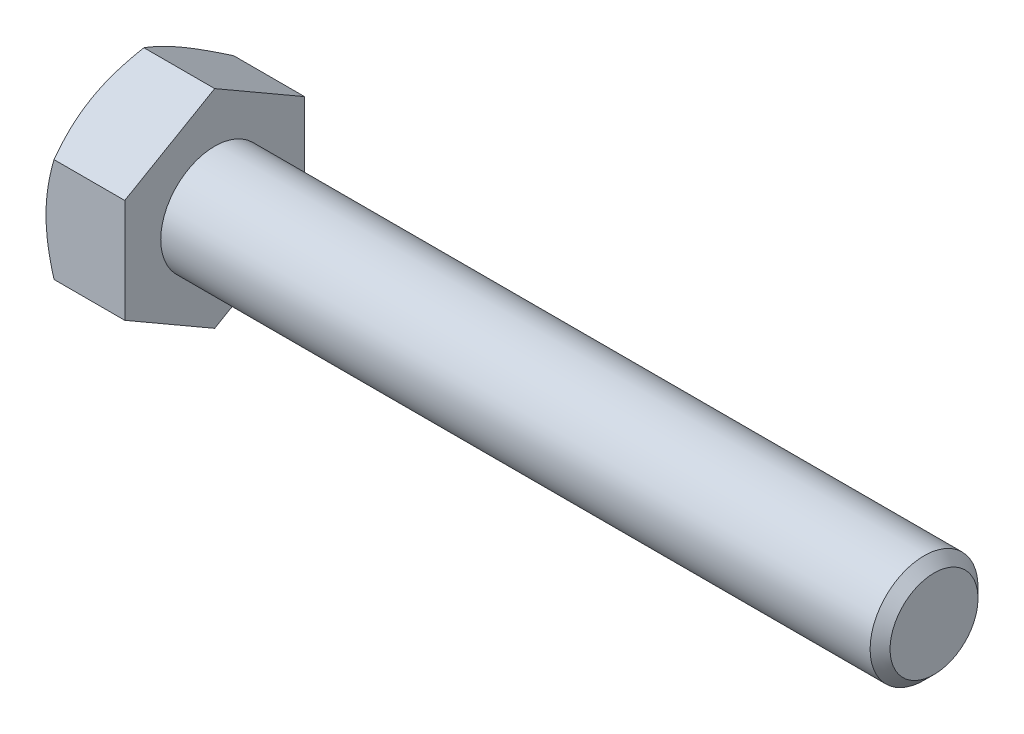
ISO-10303-21;
HEADER;
FILE_DESCRIPTION(('STEP AP214'),'2;1');
FILE_NAME('part.step','',(''),(''),'','','');
FILE_SCHEMA(('AUTOMOTIVE_DESIGN { 1 0 10303 214 1 1 1 1 }'));
ENDSEC;
DATA;
#1=APPLICATION_CONTEXT('core data for automotive mechanical design processes');
#2=APPLICATION_PROTOCOL_DEFINITION('international standard','automotive_design',2000,#1);
#3=PRODUCT_CONTEXT('',#1,'mechanical');
#4=PRODUCT('Part','Part','',(#3));
#5=PRODUCT_RELATED_PRODUCT_CATEGORY('part','',(#4));
#6=PRODUCT_DEFINITION_FORMATION('','',#4);
#7=PRODUCT_DEFINITION_CONTEXT('part definition',#1,'design');
#8=PRODUCT_DEFINITION('design','',#6,#7);
#9=PRODUCT_DEFINITION_SHAPE('','',#8);
#10=(LENGTH_UNIT() NAMED_UNIT(*) SI_UNIT(.MILLI.,.METRE.));
#11=(NAMED_UNIT(*) PLANE_ANGLE_UNIT() SI_UNIT($,.RADIAN.));
#12=(NAMED_UNIT(*) SI_UNIT($,.STERADIAN.) SOLID_ANGLE_UNIT());
#13=UNCERTAINTY_MEASURE_WITH_UNIT(LENGTH_MEASURE(1.E-05),#10,'distance_accuracy_value','');
#14=(GEOMETRIC_REPRESENTATION_CONTEXT(3) GLOBAL_UNCERTAINTY_ASSIGNED_CONTEXT((#13)) GLOBAL_UNIT_ASSIGNED_CONTEXT((#10,
#11,#12)) REPRESENTATION_CONTEXT('',''));
#15=CARTESIAN_POINT('',(0.,0.,0.));
#16=DIRECTION('',(0.,0.,1.));
#17=DIRECTION('',(1.,0.,0.));
#18=AXIS2_PLACEMENT_3D('',#15,#16,#17);
#19=CARTESIAN_POINT('',(0.,5.77350269189626,0.));
#20=DIRECTION('',(1.,0.,0.));
#21=DIRECTION('',(0.,0.,-1.));
#22=AXIS2_PLACEMENT_3D('',#19,#20,#21);
#23=PLANE('',#22);
#24=CARTESIAN_POINT('',(0.,0.,0.));
#25=DIRECTION('',(1.,0.,0.));
#26=DIRECTION('',(0.,1.,0.));
#27=AXIS2_PLACEMENT_3D('',#24,#25,#26);
#28=CIRCLE('',#27,4.99999999999545);
#29=CARTESIAN_POINT('',(1.31445443606291E-12,-4.33012701892023,-2.49999999999886));
#30=VERTEX_POINT('',#29);
#31=CARTESIAN_POINT('',(1.31276181687493E-12,0.,-4.99999999999773));
#32=VERTEX_POINT('',#31);
#33=EDGE_CURVE('E328',#30,#32,#28,.T.);
#34=ORIENTED_EDGE('',*,*,#33,.F.);
#35=CARTESIAN_POINT('',(0.,0.,0.));
#36=DIRECTION('',(1.,0.,0.));
#37=DIRECTION('',(0.,1.,0.));
#38=AXIS2_PLACEMENT_3D('',#35,#36,#37);
#39=CIRCLE('',#38,4.99999999999545);
#40=CARTESIAN_POINT('',(1.31265294309451E-12,-4.33012701892022,2.49999999999887));
#41=VERTEX_POINT('',#40);
#42=EDGE_CURVE('E327',#41,#30,#39,.T.);
#43=ORIENTED_EDGE('',*,*,#42,.F.);
#44=CARTESIAN_POINT('',(0.,0.,0.));
#45=DIRECTION('',(1.,0.,0.));
#46=DIRECTION('',(0.,1.,0.));
#47=AXIS2_PLACEMENT_3D('',#44,#45,#46);
#48=CIRCLE('',#47,4.99999999999545);
#49=CARTESIAN_POINT('',(1.31264503220733E-12,0.,4.99999999999773));
#50=VERTEX_POINT('',#49);
#51=EDGE_CURVE('E89',#50,#41,#48,.T.);
#52=ORIENTED_EDGE('',*,*,#51,.F.);
#53=CARTESIAN_POINT('',(0.,0.,0.));
#54=DIRECTION('',(1.,0.,0.));
#55=DIRECTION('',(0.,1.,0.));
#56=AXIS2_PLACEMENT_3D('',#53,#54,#55);
#57=CIRCLE('',#56,4.99999999999545);
#58=CARTESIAN_POINT('',(1.31288502633462E-12,4.33012701892022,2.49999999999887));
#59=VERTEX_POINT('',#58);
#60=EDGE_CURVE('E87',#59,#50,#57,.T.);
#61=ORIENTED_EDGE('',*,*,#60,.F.);
#62=CARTESIAN_POINT('',(0.,0.,0.));
#63=DIRECTION('',(1.,0.,0.));
#64=DIRECTION('',(0.,1.,0.));
#65=AXIS2_PLACEMENT_3D('',#62,#63,#64);
#66=CIRCLE('',#65,4.99999999999545);
#67=CARTESIAN_POINT('',(1.31224699700013E-12,4.33012701892022,-2.49999999999887));
#68=VERTEX_POINT('',#67);
#69=EDGE_CURVE('E20',#68,#59,#66,.T.);
#70=ORIENTED_EDGE('',*,*,#69,.F.);
#71=CARTESIAN_POINT('',(0.,0.,0.));
#72=DIRECTION('',(1.,0.,0.));
#73=DIRECTION('',(0.,1.,0.));
#74=AXIS2_PLACEMENT_3D('',#71,#72,#73);
#75=CIRCLE('',#74,4.99999999999545);
#76=EDGE_CURVE('E255',#32,#68,#75,.T.);
#77=ORIENTED_EDGE('',*,*,#76,.F.);
#78=EDGE_LOOP('',(#34,#43,#52,#61,#70,#77));
#79=FACE_BOUND('',#78,.T.);
#80=ADVANCED_FACE('F17',(#79),#23,.F.);
#81=CARTESIAN_POINT('',(0.449261479275265,0.,0.));
#82=DIRECTION('',(1.,0.,0.));
#83=DIRECTION('',(0.,1.,0.));
#84=AXIS2_PLACEMENT_3D('',#81,#82,#83);
#85=CONICAL_SURFACE('',#84,5.77814370797114,1.04719755118957);
#86=CARTESIAN_POINT('',(0.446581987394317,5.77350269189495,-2.27818821447054E-12));
#87=CARTESIAN_POINT('',(0.37873199161361,5.65601252710132,-0.203498934814473));
#88=CARTESIAN_POINT('',(0.316569549696799,5.53758145884731,-0.408627562225078));
#89=CARTESIAN_POINT('',(0.206947202600606,5.29967536418135,-0.820693005616808));
#90=CARTESIAN_POINT('',(0.159414596574625,5.18020863614853,-1.02761544838367));
#91=CARTESIAN_POINT('',(0.101052626368534,4.99988106812553,-1.33995195820484));
#92=CARTESIAN_POINT('',(0.083747708038701,4.93954408647721,-1.44445867599508));
#93=CARTESIAN_POINT('',(0.053792533680768,4.81858126545494,-1.65397242783251));
#94=CARTESIAN_POINT('',(0.0411421551416429,4.7579554337263,-1.75897944863763));
#95=CARTESIAN_POINT('',(0.0207183273002109,4.63619066509474,-1.96988221447936));
#96=CARTESIAN_POINT('',(0.0129696792605214,4.57505068020447,-2.0757797746833));
#97=CARTESIAN_POINT('',(0.00259979047148607,4.45265046787549,-2.28778316129432));
#98=CARTESIAN_POINT('',(-2.04348110585966E-05,4.39139021902687,-2.39388902478444));
#99=CARTESIAN_POINT('',(2.62476469222933E-12,4.33012701892219,-2.5));
#100=B_SPLINE_CURVE_WITH_KNOTS('',3,(#86,#87,#88,#89,#90,#91,#92,#93,#94,#95,#96,#97,#98,#99),
.UNSPECIFIED.,.F.,.F.,(4,2,2,2,2,2,4),(0.,0.734036658390385,1.46436443241443,1.83000749078048,
2.19564092445472,2.56310985866278,2.93065154716303),.UNSPECIFIED.);
#101=CARTESIAN_POINT('',(0.446581987394317,5.77350269189495,0.));
#102=VERTEX_POINT('',#101);
#103=EDGE_CURVE('E99',#102,#68,#100,.T.);
#104=ORIENTED_EDGE('',*,*,#103,.T.);
#105=ORIENTED_EDGE('',*,*,#69,.T.);
#106=CARTESIAN_POINT('',(2.62552985528741E-12,4.33012701892219,2.5));
#107=CARTESIAN_POINT('',(-2.04348110582996E-05,4.39139021902687,2.39388902478444));
#108=CARTESIAN_POINT('',(0.00259979047148634,4.45265046787549,2.28778316129432));
#109=CARTESIAN_POINT('',(0.0129696792605219,4.57505068020448,2.0757797746833));
#110=CARTESIAN_POINT('',(0.0207183273002116,4.63619066509475,1.96988221447936));
#111=CARTESIAN_POINT('',(0.0411421551416436,4.7579554337263,1.75897944863763));
#112=CARTESIAN_POINT('',(0.0537925336807684,4.81858126545494,1.65397242783251));
#113=CARTESIAN_POINT('',(0.0837477080387013,4.93954408647721,1.44445867599508));
#114=CARTESIAN_POINT('',(0.101052626368535,4.99988106812553,1.33995195820484));
#115=CARTESIAN_POINT('',(0.159414596574626,5.18020863614853,1.02761544838367));
#116=CARTESIAN_POINT('',(0.206947202600607,5.29967536418135,0.820693005616808));
#117=CARTESIAN_POINT('',(0.3165695496968,5.53758145884731,0.408627562225078));
#118=CARTESIAN_POINT('',(0.37873199161361,5.65601252710132,0.203498934814474));
#119=CARTESIAN_POINT('',(0.446581987394317,5.77350269189495,2.279010260297E-12));
#120=B_SPLINE_CURVE_WITH_KNOTS('',3,(#106,#107,#108,#109,#110,#111,#112,#113,#114,#115,#116,
#117,#118,#119),.UNSPECIFIED.,.F.,.F.,(4,2,2,2,2,2,4),(0.,0.367541688500245,0.735010622708304,
1.10064405638254,1.4662871147486,2.19661488877264,2.93065154716302),.UNSPECIFIED.);
#121=EDGE_CURVE('E97',#59,#102,#120,.T.);
#122=ORIENTED_EDGE('',*,*,#121,.T.);
#123=EDGE_LOOP('',(#104,#105,#122));
#124=FACE_BOUND('',#123,.T.);
#125=ADVANCED_FACE('F95',(#124),#85,.T.);
#126=CARTESIAN_POINT('',(0.449261479275265,0.,0.));
#127=DIRECTION('',(1.,0.,0.));
#128=DIRECTION('',(0.,1.,0.));
#129=AXIS2_PLACEMENT_3D('',#126,#127,#128);
#130=CONICAL_SURFACE('',#129,5.77814370797114,1.04719755118957);
#131=CARTESIAN_POINT('',(0.446581987394314,2.88675134594944,4.99999999999772));
#132=CARTESIAN_POINT('',(0.378731991613608,3.00424151074306,4.79650106518553));
#133=CARTESIAN_POINT('',(0.316569549696798,3.12267257899707,4.59137243777492));
#134=CARTESIAN_POINT('',(0.206947202600605,3.36057867366303,4.1793069943832));
#135=CARTESIAN_POINT('',(0.159414596574625,3.48004540169586,3.97238455161633));
#136=CARTESIAN_POINT('',(0.101052626368534,3.66037296971886,3.66004804179516));
#137=CARTESIAN_POINT('',(0.0837477080387011,3.72070995136718,3.55554132400492));
#138=CARTESIAN_POINT('',(0.0537925336807682,3.84167277238944,3.3460275721675));
#139=CARTESIAN_POINT('',(0.0411421551416431,3.90229860411808,3.24102055136238));
#140=CARTESIAN_POINT('',(0.0207183273002111,4.02406337274964,3.03011778552065));
#141=CARTESIAN_POINT('',(0.0129696792605216,4.08520335763991,2.92422022531671));
#142=CARTESIAN_POINT('',(0.00259979047148639,4.20760356996889,2.71221683870569));
#143=CARTESIAN_POINT('',(-2.04348110581854E-05,4.26886381881751,2.60611097521557));
#144=CARTESIAN_POINT('',(2.62530247415424E-12,4.33012701892219,2.5));
#145=B_SPLINE_CURVE_WITH_KNOTS('',3,(#131,#132,#133,#134,#135,#136,#137,#138,#139,#140,#141,
#142,#143,#144),.UNSPECIFIED.,.F.,.F.,(4,2,2,2,2,2,4),(0.,0.734036658390382,1.46436443241442,
1.83000749078047,2.19564092445471,2.56310985866277,2.93065154716302),.UNSPECIFIED.);
#146=CARTESIAN_POINT('',(0.446581987394314,2.88675134594747,4.99999999999886));
#147=VERTEX_POINT('',#146);
#148=EDGE_CURVE('E102',#147,#59,#145,.T.);
#149=ORIENTED_EDGE('',*,*,#148,.T.);
#150=ORIENTED_EDGE('',*,*,#60,.T.);
#151=CARTESIAN_POINT('',(2.62529284589109E-12,0.,5.));
#152=CARTESIAN_POINT('',(-2.04348110587406E-05,0.122526400209358,5.));
#153=CARTESIAN_POINT('',(0.00259979047148595,0.245046897906593,5.));
#154=CARTESIAN_POINT('',(0.0129696792605216,0.489847322564566,5.));
#155=CARTESIAN_POINT('',(0.0207183273002114,0.612127292345107,5.));
#156=CARTESIAN_POINT('',(0.0411421551416433,0.855656829608219,5.));
#157=CARTESIAN_POINT('',(0.0537925336807679,0.976908493065498,5.));
#158=CARTESIAN_POINT('',(0.0837477080387005,1.21883413511003,5.));
#159=CARTESIAN_POINT('',(0.101052626368534,1.33950809840666,5.));
#160=CARTESIAN_POINT('',(0.159414596574625,1.70016323445266,5.));
#161=CARTESIAN_POINT('',(0.206947202600606,1.93909669051831,5.));
#162=CARTESIAN_POINT('',(0.316569549696798,2.41490887985023,5.));
#163=CARTESIAN_POINT('',(0.378731991613608,2.65177101635825,5.));
#164=CARTESIAN_POINT('',(0.446581987394314,2.88675134594549,5.));
#165=B_SPLINE_CURVE_WITH_KNOTS('',3,(#151,#152,#153,#154,#155,#156,#157,#158,#159,#160,#161,
#162,#163,#164),.UNSPECIFIED.,.F.,.F.,(4,2,2,2,2,2,4),(0.,0.367541688500244,0.735010622708302,
1.10064405638254,1.46628711474859,2.19661488877263,2.93065154716301),.UNSPECIFIED.);
#166=EDGE_CURVE('E105',#50,#147,#165,.T.);
#167=ORIENTED_EDGE('',*,*,#166,.T.);
#168=EDGE_LOOP('',(#149,#150,#167));
#169=FACE_BOUND('',#168,.T.);
#170=ADVANCED_FACE('F103',(#169),#130,.T.);
#171=CARTESIAN_POINT('',(0.449261479275265,0.,0.));
#172=DIRECTION('',(1.,0.,0.));
#173=DIRECTION('',(0.,1.,0.));
#174=AXIS2_PLACEMENT_3D('',#171,#172,#173);
#175=CONICAL_SURFACE('',#174,5.77814370797114,1.04719755118957);
#176=ORIENTED_EDGE('',*,*,#51,.T.);
#177=CARTESIAN_POINT('',(2.62536398849459E-12,-4.33012701892219,2.50000000000001));
#178=CARTESIAN_POINT('',(-2.04348110580301E-05,-4.26886381881751,2.60611097521557));
#179=CARTESIAN_POINT('',(0.0025997904714866,-4.20760356996889,2.71221683870569));
#180=CARTESIAN_POINT('',(0.0129696792605219,-4.0852033576399,2.92422022531671));
#181=CARTESIAN_POINT('',(0.0207183273002113,-4.02406337274963,3.03011778552066));
#182=CARTESIAN_POINT('',(0.0411421551416433,-3.90229860411808,3.24102055136238));
#183=CARTESIAN_POINT('',(0.0537925336807684,-3.84167277238944,3.3460275721675));
#184=CARTESIAN_POINT('',(0.0837477080387012,-3.72070995136717,3.55554132400492));
#185=CARTESIAN_POINT('',(0.101052626368534,-3.66037296971885,3.66004804179516));
#186=CARTESIAN_POINT('',(0.159414596574624,-3.48004540169585,3.97238455161633));
#187=CARTESIAN_POINT('',(0.206947202600605,-3.36057867366303,4.1793069943832));
#188=CARTESIAN_POINT('',(0.316569549696797,-3.12267257899707,4.59137243777492));
#189=CARTESIAN_POINT('',(0.378731991613607,-3.00424151074306,4.79650106518553));
#190=CARTESIAN_POINT('',(0.446581987394313,-2.88675134594944,4.99999999999772));
#191=B_SPLINE_CURVE_WITH_KNOTS('',3,(#177,#178,#179,#180,#181,#182,#183,#184,#185,#186,#187,
#188,#189,#190),.UNSPECIFIED.,.F.,.F.,(4,2,2,2,2,2,4),(0.,0.367541688500244,0.7350106227083,
1.10064405638254,1.46628711474859,2.19661488877263,2.93065154716301),.UNSPECIFIED.);
#192=CARTESIAN_POINT('',(0.446581987394313,-2.88675134594746,4.99999999999886));
#193=VERTEX_POINT('',#192);
#194=EDGE_CURVE('E174',#41,#193,#191,.T.);
#195=ORIENTED_EDGE('',*,*,#194,.T.);
#196=CARTESIAN_POINT('',(0.446581987394313,-2.88675134594549,5.));
#197=CARTESIAN_POINT('',(0.378731991613607,-2.65177101635825,5.));
#198=CARTESIAN_POINT('',(0.316569549696796,-2.41490887985022,5.));
#199=CARTESIAN_POINT('',(0.206947202600604,-1.93909669051831,5.));
#200=CARTESIAN_POINT('',(0.159414596574623,-1.70016323445266,5.));
#201=CARTESIAN_POINT('',(0.101052626368533,-1.33950809840666,5.));
#202=CARTESIAN_POINT('',(0.0837477080387004,-1.21883413511003,5.));
#203=CARTESIAN_POINT('',(0.0537925336807677,-0.976908493065497,5.));
#204=CARTESIAN_POINT('',(0.0411421551416427,-0.855656829608219,5.));
#205=CARTESIAN_POINT('',(0.0207183273002108,-0.612127292345107,5.));
#206=CARTESIAN_POINT('',(0.0129696792605213,-0.489847322564566,5.));
#207=CARTESIAN_POINT('',(0.00259979047148612,-0.245046897906593,5.));
#208=CARTESIAN_POINT('',(-2.04348110584022E-05,-0.122526400209359,5.));
#209=CARTESIAN_POINT('',(2.62529006441466E-12,0.,5.));
#210=B_SPLINE_CURVE_WITH_KNOTS('',3,(#196,#197,#198,#199,#200,#201,#202,#203,#204,#205,#206,
#207,#208,#209),.UNSPECIFIED.,.F.,.F.,(4,2,2,2,2,2,4),(0.,0.73403665839038,1.46436443241442,
1.83000749078047,2.19564092445471,2.56310985866277,2.93065154716301),.UNSPECIFIED.);
#211=EDGE_CURVE('E148',#193,#50,#210,.T.);
#212=ORIENTED_EDGE('',*,*,#211,.T.);
#213=EDGE_LOOP('',(#176,#195,#212));
#214=FACE_BOUND('',#213,.T.);
#215=ADVANCED_FACE('F139',(#214),#175,.T.);
#216=CARTESIAN_POINT('',(0.449261479275265,0.,0.));
#217=DIRECTION('',(1.,0.,0.));
#218=DIRECTION('',(0.,1.,0.));
#219=AXIS2_PLACEMENT_3D('',#216,#217,#218);
#220=CONICAL_SURFACE('',#219,5.77814370797114,1.04719755118957);
#221=ORIENTED_EDGE('',*,*,#42,.T.);
#222=CARTESIAN_POINT('',(2.62887455541919E-12,-4.3301270189222,-2.5));
#223=CARTESIAN_POINT('',(-2.04348110543904E-05,-4.39139021902688,-2.39388902478444));
#224=CARTESIAN_POINT('',(0.00259979047149012,-4.4526504678755,-2.28778316129432));
#225=CARTESIAN_POINT('',(0.0129696792605251,-4.57505068020448,-2.0757797746833));
#226=CARTESIAN_POINT('',(0.0207183273002144,-4.63619066509475,-1.96988221447935));
#227=CARTESIAN_POINT('',(0.0411421551416465,-4.75795543372631,-1.75897944863763));
#228=CARTESIAN_POINT('',(0.0537925336807718,-4.81858126545495,-1.6539724278325));
#229=CARTESIAN_POINT('',(0.0837477080387049,-4.93954408647721,-1.44445867599508));
#230=CARTESIAN_POINT('',(0.101052626368538,-4.99988106812553,-1.33995195820484));
#231=CARTESIAN_POINT('',(0.159414596574629,-5.18020863614853,-1.02761544838367));
#232=CARTESIAN_POINT('',(0.20694720260061,-5.29967536418136,-0.820693005616806));
#233=CARTESIAN_POINT('',(0.316569549696803,-5.53758145884732,-0.408627562225076));
#234=CARTESIAN_POINT('',(0.378731991613614,-5.65601252710133,-0.203498934814472));
#235=CARTESIAN_POINT('',(0.44658198739432,-5.77350269189495,-2.27714056377501E-12));
#236=B_SPLINE_CURVE_WITH_KNOTS('',3,(#222,#223,#224,#225,#226,#227,#228,#229,#230,#231,#232,
#233,#234,#235),.UNSPECIFIED.,.F.,.F.,(4,2,2,2,2,2,4),(0.,0.367541688500245,0.735010622708303,
1.10064405638254,1.4662871147486,2.19661488877264,2.93065154716302),.UNSPECIFIED.);
#237=CARTESIAN_POINT('',(0.446581987394319,-5.77350269189495,0.));
#238=VERTEX_POINT('',#237);
#239=EDGE_CURVE('E302',#30,#238,#236,.T.);
#240=ORIENTED_EDGE('',*,*,#239,.T.);
#241=CARTESIAN_POINT('',(0.446581987394319,-5.77350269189495,2.27890301672166E-12));
#242=CARTESIAN_POINT('',(0.378731991613612,-5.65601252710133,0.203498934814475));
#243=CARTESIAN_POINT('',(0.316569549696802,-5.53758145884731,0.408627562225079));
#244=CARTESIAN_POINT('',(0.206947202600608,-5.29967536418135,0.82069300561681));
#245=CARTESIAN_POINT('',(0.159414596574627,-5.18020863614853,1.02761544838368));
#246=CARTESIAN_POINT('',(0.101052626368535,-4.99988106812553,1.33995195820485));
#247=CARTESIAN_POINT('',(0.083747708038702,-4.93954408647721,1.44445867599509));
#248=CARTESIAN_POINT('',(0.0537925336807687,-4.81858126545494,1.65397242783251));
#249=CARTESIAN_POINT('',(0.0411421551416434,-4.7579554337263,1.75897944863764));
#250=CARTESIAN_POINT('',(0.0207183273002114,-4.63619066509474,1.96988221447936));
#251=CARTESIAN_POINT('',(0.0129696792605221,-4.57505068020447,2.0757797746833));
#252=CARTESIAN_POINT('',(0.00259979047148702,-4.45265046787549,2.28778316129433));
#253=CARTESIAN_POINT('',(-2.0434811057605E-05,-4.39139021902687,2.39388902478444));
#254=CARTESIAN_POINT('',(2.62541076660964E-12,-4.33012701892219,2.50000000000001));
#255=B_SPLINE_CURVE_WITH_KNOTS('',3,(#241,#242,#243,#244,#245,#246,#247,#248,#249,#250,#251,
#252,#253,#254),.UNSPECIFIED.,.F.,.F.,(4,2,2,2,2,2,4),(0.,0.734036658390386,1.46436443241443,
1.83000749078048,2.19564092445473,2.56310985866278,2.93065154716303),.UNSPECIFIED.);
#256=EDGE_CURVE('E169',#238,#41,#255,.T.);
#257=ORIENTED_EDGE('',*,*,#256,.T.);
#258=EDGE_LOOP('',(#221,#240,#257));
#259=FACE_BOUND('',#258,.T.);
#260=ADVANCED_FACE('F318',(#259),#220,.T.);
#261=CARTESIAN_POINT('',(0.449261479275265,0.,0.));
#262=DIRECTION('',(1.,0.,0.));
#263=DIRECTION('',(0.,1.,0.));
#264=AXIS2_PLACEMENT_3D('',#261,#262,#263);
#265=CONICAL_SURFACE('',#264,5.77814370797114,1.04719755118957);
#266=ORIENTED_EDGE('',*,*,#33,.T.);
#267=CARTESIAN_POINT('',(2.62554162158813E-12,0.,-5.));
#268=CARTESIAN_POINT('',(-2.04348110577638E-05,-0.122526400209367,-5.));
#269=CARTESIAN_POINT('',(0.0025997904714872,-0.24504689790661,-5.));
#270=CARTESIAN_POINT('',(0.0129696792605238,-0.4898473225646,-5.));
#271=CARTESIAN_POINT('',(0.0207183273002142,-0.61212729234515,-5.));
#272=CARTESIAN_POINT('',(0.0411421551416489,-0.855656829608277,-5.));
#273=CARTESIAN_POINT('',(0.0537925336807756,-0.976908493065564,-5.));
#274=CARTESIAN_POINT('',(0.0837477080387122,-1.21883413511011,-5.));
#275=CARTESIAN_POINT('',(0.101052626368547,-1.33950809840675,-5.));
#276=CARTESIAN_POINT('',(0.159414596574645,-1.70016323445278,-5.));
#277=CARTESIAN_POINT('',(0.206947202600632,-1.93909669051844,-5.));
#278=CARTESIAN_POINT('',(0.316569549696838,-2.41490887985039,-5.));
#279=CARTESIAN_POINT('',(0.378731991613656,-2.65177101635842,-5.));
#280=CARTESIAN_POINT('',(0.446581987394369,-2.88675134594568,-5.));
#281=B_SPLINE_CURVE_WITH_KNOTS('',3,(#267,#268,#269,#270,#271,#272,#273,#274,#275,#276,#277,
#278,#279,#280),.UNSPECIFIED.,.F.,.F.,(4,2,2,2,2,2,4),(0.,0.367541688500269,0.735010622708351,
1.10064405638261,1.46628711474869,2.19661488877278,2.93065154716321),.UNSPECIFIED.);
#282=CARTESIAN_POINT('',(0.446581987394308,-2.88675134594763,-4.99999999999876));
#283=VERTEX_POINT('',#282);
#284=EDGE_CURVE('E233',#32,#283,#281,.T.);
#285=ORIENTED_EDGE('',*,*,#284,.T.);
#286=CARTESIAN_POINT('',(0.446581987394246,-2.88675134594957,-4.99999999999751));
#287=CARTESIAN_POINT('',(0.37873199161355,-3.00424151074319,-4.79650106518533));
#288=CARTESIAN_POINT('',(0.316569549696749,-3.12267257899719,-4.59137243777475));
#289=CARTESIAN_POINT('',(0.206947202600574,-3.36057867366312,-4.17930699438305));
#290=CARTESIAN_POINT('',(0.159414596574601,-3.48004540169594,-3.9723845516162));
#291=CARTESIAN_POINT('',(0.10105262636852,-3.66037296971892,-3.66004804179506));
#292=CARTESIAN_POINT('',(0.0837477080386896,-3.72070995136724,-3.55554132400483));
#293=CARTESIAN_POINT('',(0.0537925336807619,-3.84167277238949,-3.34602757216742));
#294=CARTESIAN_POINT('',(0.0411421551416391,-3.90229860411813,-3.24102055136231));
#295=CARTESIAN_POINT('',(0.0207183273002108,-4.02406337274967,-3.0301177855206));
#296=CARTESIAN_POINT('',(0.0129696792605228,-4.08520335763994,-2.92422022531667));
#297=CARTESIAN_POINT('',(0.00259979047148944,-4.20760356996891,-2.71221683870567));
#298=CARTESIAN_POINT('',(-2.04348110547413E-05,-4.26886381881752,-2.60611097521556));
#299=CARTESIAN_POINT('',(2.62851298101351E-12,-4.3301270189222,-2.5));
#300=B_SPLINE_CURVE_WITH_KNOTS('',3,(#286,#287,#288,#289,#290,#291,#292,#293,#294,#295,#296,
#297,#298,#299),.UNSPECIFIED.,.F.,.F.,(4,2,2,2,2,2,4),(0.,0.734036658390318,1.46436443241429,
1.83000749078031,2.19564092445452,2.56310985866255,2.93065154716276),.UNSPECIFIED.);
#301=EDGE_CURVE('E301',#283,#30,#300,.T.);
#302=ORIENTED_EDGE('',*,*,#301,.T.);
#303=EDGE_LOOP('',(#266,#285,#302));
#304=FACE_BOUND('',#303,.T.);
#305=ADVANCED_FACE('F247',(#304),#265,.T.);
#306=CARTESIAN_POINT('',(0.449261479275265,0.,0.));
#307=DIRECTION('',(1.,0.,0.));
#308=DIRECTION('',(0.,1.,0.));
#309=AXIS2_PLACEMENT_3D('',#306,#307,#308);
#310=CONICAL_SURFACE('',#309,5.77814370797114,1.04719755118957);
#311=CARTESIAN_POINT('',(0.446581987394314,2.88675134594549,-5.));
#312=CARTESIAN_POINT('',(0.378731991613607,2.65177101635825,-5.));
#313=CARTESIAN_POINT('',(0.316569549696797,2.41490887985023,-5.));
#314=CARTESIAN_POINT('',(0.206947202600605,1.93909669051831,-5.));
#315=CARTESIAN_POINT('',(0.159414596574625,1.70016323445266,-5.));
#316=CARTESIAN_POINT('',(0.101052626368534,1.33950809840666,-5.));
#317=CARTESIAN_POINT('',(0.0837477080387007,1.21883413511003,-5.));
#318=CARTESIAN_POINT('',(0.0537925336807681,0.976908493065498,-5.));
#319=CARTESIAN_POINT('',(0.0411421551416434,0.855656829608219,-5.));
#320=CARTESIAN_POINT('',(0.0207183273002116,0.612127292345108,-5.));
#321=CARTESIAN_POINT('',(0.0129696792605218,0.489847322564566,-5.));
#322=CARTESIAN_POINT('',(0.00259979047148617,0.245046897906593,-5.));
#323=CARTESIAN_POINT('',(-2.04348110584997E-05,0.122526400209358,-5.));
#324=CARTESIAN_POINT('',(2.62552363374986E-12,0.,-5.));
#325=B_SPLINE_CURVE_WITH_KNOTS('',3,(#311,#312,#313,#314,#315,#316,#317,#318,#319,#320,#321,
#322,#323,#324),.UNSPECIFIED.,.F.,.F.,(4,2,2,2,2,2,4),(0.,0.734036658390381,1.46436443241442,
1.83000749078047,2.19564092445471,2.56310985866277,2.93065154716301),.UNSPECIFIED.);
#326=CARTESIAN_POINT('',(0.446581987394694,2.88675134594878,-4.99999999999886));
#327=VERTEX_POINT('',#326);
#328=EDGE_CURVE('E225',#327,#32,#325,.T.);
#329=ORIENTED_EDGE('',*,*,#328,.T.);
#330=ORIENTED_EDGE('',*,*,#76,.T.);
#331=CARTESIAN_POINT('',(2.62466282953535E-12,4.33012701892219,-2.50000000000001));
#332=CARTESIAN_POINT('',(-2.04348110588146E-05,4.26886381881751,-2.60611097521557));
#333=CARTESIAN_POINT('',(0.00259979047148583,4.20760356996889,-2.71221683870569));
#334=CARTESIAN_POINT('',(0.0129696792605211,4.08520335763991,-2.92422022531671));
#335=CARTESIAN_POINT('',(0.0207183273002106,4.02406337274963,-3.03011778552065));
#336=CARTESIAN_POINT('',(0.0411421551416424,3.90229860411808,-3.24102055136238));
#337=CARTESIAN_POINT('',(0.0537925336807672,3.84167277238944,-3.3460275721675));
#338=CARTESIAN_POINT('',(0.0837477080387001,3.72070995136717,-3.55554132400492));
#339=CARTESIAN_POINT('',(0.101052626368534,3.66037296971886,-3.66004804179516));
#340=CARTESIAN_POINT('',(0.159414596574624,3.48004540169586,-3.97238455161633));
#341=CARTESIAN_POINT('',(0.206947202600605,3.36057867366303,-4.17930699438319));
#342=CARTESIAN_POINT('',(0.316569549696797,3.12267257899707,-4.59137243777492));
#343=CARTESIAN_POINT('',(0.378731991613607,3.00424151074306,-4.79650106518553));
#344=CARTESIAN_POINT('',(0.446581987394314,2.88675134594944,-4.99999999999772));
#345=B_SPLINE_CURVE_WITH_KNOTS('',3,(#331,#332,#333,#334,#335,#336,#337,#338,#339,#340,#341,
#342,#343,#344),.UNSPECIFIED.,.F.,.F.,(4,2,2,2,2,2,4),(0.,0.367541688500244,0.735010622708302,
1.10064405638254,1.46628711474859,2.19661488877263,2.93065154716301),.UNSPECIFIED.);
#346=EDGE_CURVE('E115',#68,#327,#345,.T.);
#347=ORIENTED_EDGE('',*,*,#346,.T.);
#348=EDGE_LOOP('',(#329,#330,#347));
#349=FACE_BOUND('',#348,.T.);
#350=ADVANCED_FACE('F242',(#349),#310,.T.);
#351=CARTESIAN_POINT('',(44.38,0.,0.));
#352=DIRECTION('',(-1.,0.,0.));
#353=DIRECTION('',(0.,0.,1.));
#354=AXIS2_PLACEMENT_3D('',#351,#352,#353);
#355=PLANE('',#354);
#356=CARTESIAN_POINT('',(44.3800000000465,0.,0.));
#357=DIRECTION('',(-1.,0.,0.));
#358=DIRECTION('',(0.,0.,1.));
#359=AXIS2_PLACEMENT_3D('',#356,#357,#358);
#360=CIRCLE('',#359,2.4454999999648);
#361=CARTESIAN_POINT('',(44.3800000000465,0.,2.4454999999648));
#362=VERTEX_POINT('',#361);
#363=EDGE_CURVE('E196',#362,#362,#360,.T.);
#364=ORIENTED_EDGE('',*,*,#363,.F.);
#365=EDGE_LOOP('',(#364));
#366=FACE_BOUND('',#365,.T.);
#367=ADVANCED_FACE('F246',(#366),#355,.F.);
#368=CARTESIAN_POINT('',(4.38,2.88675134594812,-5.));
#369=DIRECTION('',(0.,-0.866025403784438,0.500000000000001));
#370=DIRECTION('',(0.,-0.500000000000001,-0.866025403784438));
#371=AXIS2_PLACEMENT_3D('',#368,#369,#370);
#372=PLANE('',#371);
#373=DIRECTION('',(1.,0.,0.));
#374=VECTOR('',#373,1.);
#375=CARTESIAN_POINT('',(4.38,5.77350269189626,0.));
#376=LINE('',#375,#374);
#377=CARTESIAN_POINT('',(4.38,5.77350269189626,0.));
#378=VERTEX_POINT('',#377);
#379=EDGE_CURVE('E108',#102,#378,#376,.T.);
#380=ORIENTED_EDGE('',*,*,#379,.T.);
#381=DIRECTION('',(0.,0.500000000000001,0.866025403784438));
#382=VECTOR('',#381,1.);
#383=CARTESIAN_POINT('',(4.38,2.88675134594812,-5.));
#384=LINE('',#383,#382);
#385=CARTESIAN_POINT('',(4.38,2.88675134594812,-5.));
#386=VERTEX_POINT('',#385);
#387=EDGE_CURVE('E192',#386,#378,#384,.T.);
#388=ORIENTED_EDGE('',*,*,#387,.F.);
#389=DIRECTION('',(1.,0.,0.));
#390=VECTOR('',#389,1.);
#391=CARTESIAN_POINT('',(4.38,2.88675134594812,-5.));
#392=LINE('',#391,#390);
#393=EDGE_CURVE('E232',#386,#327,#392,.F.);
#394=ORIENTED_EDGE('',*,*,#393,.T.);
#395=ORIENTED_EDGE('',*,*,#346,.F.);
#396=ORIENTED_EDGE('',*,*,#103,.F.);
#397=EDGE_LOOP('',(#380,#388,#394,#395,#396));
#398=FACE_BOUND('',#397,.T.);
#399=ADVANCED_FACE('F257',(#398),#372,.F.);
#400=CARTESIAN_POINT('',(4.38,5.77350269189626,0.));
#401=DIRECTION('',(0.,-0.866025403784438,-0.500000000000001));
#402=DIRECTION('',(0.,0.500000000000001,-0.866025403784438));
#403=AXIS2_PLACEMENT_3D('',#400,#401,#402);
#404=PLANE('',#403);
#405=DIRECTION('',(1.,0.,0.));
#406=VECTOR('',#405,1.);
#407=CARTESIAN_POINT('',(4.38,2.88675134594812,5.));
#408=LINE('',#407,#406);
#409=CARTESIAN_POINT('',(4.38,2.88675134594812,5.));
#410=VERTEX_POINT('',#409);
#411=EDGE_CURVE('E147',#147,#410,#408,.T.);
#412=ORIENTED_EDGE('',*,*,#411,.T.);
#413=DIRECTION('',(0.,-0.500000000000001,0.866025403784438));
#414=VECTOR('',#413,1.);
#415=CARTESIAN_POINT('',(4.38,5.77350269189626,0.));
#416=LINE('',#415,#414);
#417=EDGE_CURVE('E195',#378,#410,#416,.T.);
#418=ORIENTED_EDGE('',*,*,#417,.F.);
#419=ORIENTED_EDGE('',*,*,#379,.F.);
#420=ORIENTED_EDGE('',*,*,#121,.F.);
#421=ORIENTED_EDGE('',*,*,#148,.F.);
#422=EDGE_LOOP('',(#412,#418,#419,#420,#421));
#423=FACE_BOUND('',#422,.T.);
#424=ADVANCED_FACE('F111',(#423),#404,.F.);
#425=CARTESIAN_POINT('',(4.38,2.88675134594813,5.));
#426=DIRECTION('',(0.,0.,-1.));
#427=DIRECTION('',(0.,1.,0.));
#428=AXIS2_PLACEMENT_3D('',#425,#426,#427);
#429=PLANE('',#428);
#430=DIRECTION('',(1.,0.,0.));
#431=VECTOR('',#430,1.);
#432=CARTESIAN_POINT('',(4.38,-2.88675134594812,5.));
#433=LINE('',#432,#431);
#434=CARTESIAN_POINT('',(4.38,-2.88675134594812,5.));
#435=VERTEX_POINT('',#434);
#436=EDGE_CURVE('E178',#193,#435,#433,.T.);
#437=ORIENTED_EDGE('',*,*,#436,.T.);
#438=DIRECTION('',(0.,1.,0.));
#439=VECTOR('',#438,1.);
#440=CARTESIAN_POINT('',(4.38,5.77350269189626,5.));
#441=LINE('',#440,#439);
#442=EDGE_CURVE('E212',#410,#435,#441,.F.);
#443=ORIENTED_EDGE('',*,*,#442,.F.);
#444=ORIENTED_EDGE('',*,*,#411,.F.);
#445=ORIENTED_EDGE('',*,*,#166,.F.);
#446=ORIENTED_EDGE('',*,*,#211,.F.);
#447=EDGE_LOOP('',(#437,#443,#444,#445,#446));
#448=FACE_BOUND('',#447,.T.);
#449=ADVANCED_FACE('F153',(#448),#429,.F.);
#450=CARTESIAN_POINT('',(4.38,-5.77350269189627,0.));
#451=DIRECTION('',(0.,0.866025403784438,-0.500000000000002));
#452=DIRECTION('',(0.,0.500000000000002,0.866025403784438));
#453=AXIS2_PLACEMENT_3D('',#450,#451,#452);
#454=PLANE('',#453);
#455=DIRECTION('',(1.,0.,0.));
#456=VECTOR('',#455,1.);
#457=CARTESIAN_POINT('',(4.38,-5.77350269189627,0.));
#458=LINE('',#457,#456);
#459=CARTESIAN_POINT('',(4.38,-5.77350269189627,0.));
#460=VERTEX_POINT('',#459);
#461=EDGE_CURVE('E299',#238,#460,#458,.T.);
#462=ORIENTED_EDGE('',*,*,#461,.T.);
#463=DIRECTION('',(0.,-0.500000000000002,-0.866025403784437));
#464=VECTOR('',#463,1.);
#465=CARTESIAN_POINT('',(4.38,-2.88675134594812,5.));
#466=LINE('',#465,#464);
#467=EDGE_CURVE('E207',#435,#460,#466,.T.);
#468=ORIENTED_EDGE('',*,*,#467,.F.);
#469=ORIENTED_EDGE('',*,*,#436,.F.);
#470=ORIENTED_EDGE('',*,*,#194,.F.);
#471=ORIENTED_EDGE('',*,*,#256,.F.);
#472=EDGE_LOOP('',(#462,#468,#469,#470,#471));
#473=FACE_BOUND('',#472,.T.);
#474=ADVANCED_FACE('F157',(#473),#454,.F.);
#475=CARTESIAN_POINT('',(4.38,-2.88675134594813,-5.));
#476=DIRECTION('',(0.,0.866025403784439,0.5));
#477=DIRECTION('',(0.,-0.5,0.866025403784439));
#478=AXIS2_PLACEMENT_3D('',#475,#476,#477);
#479=PLANE('',#478);
#480=DIRECTION('',(1.,0.,0.));
#481=VECTOR('',#480,1.);
#482=CARTESIAN_POINT('',(4.38,-2.88675134594852,-5.));
#483=LINE('',#482,#481);
#484=CARTESIAN_POINT('',(4.38,-2.88675134594837,-5.));
#485=VERTEX_POINT('',#484);
#486=EDGE_CURVE('E35',#283,#485,#483,.T.);
#487=ORIENTED_EDGE('',*,*,#486,.T.);
#488=DIRECTION('',(0.,0.5,-0.866025403784439));
#489=VECTOR('',#488,1.);
#490=CARTESIAN_POINT('',(4.38,-5.77350269189627,0.));
#491=LINE('',#490,#489);
#492=EDGE_CURVE('E202',#460,#485,#491,.T.);
#493=ORIENTED_EDGE('',*,*,#492,.F.);
#494=ORIENTED_EDGE('',*,*,#461,.F.);
#495=ORIENTED_EDGE('',*,*,#239,.F.);
#496=ORIENTED_EDGE('',*,*,#301,.F.);
#497=EDGE_LOOP('',(#487,#493,#494,#495,#496));
#498=FACE_BOUND('',#497,.T.);
#499=ADVANCED_FACE('F163',(#498),#479,.F.);
#500=CARTESIAN_POINT('',(4.38,2.88675134594812,-5.));
#501=DIRECTION('',(0.,0.,1.));
#502=DIRECTION('',(1.,0.,0.));
#503=AXIS2_PLACEMENT_3D('',#500,#501,#502);
#504=PLANE('',#503);
#505=ORIENTED_EDGE('',*,*,#393,.F.);
#506=DIRECTION('',(0.,1.,0.));
#507=VECTOR('',#506,1.);
#508=CARTESIAN_POINT('',(4.38,5.77350269189626,-5.));
#509=LINE('',#508,#507);
#510=EDGE_CURVE('E199',#485,#386,#509,.T.);
#511=ORIENTED_EDGE('',*,*,#510,.F.);
#512=ORIENTED_EDGE('',*,*,#486,.F.);
#513=ORIENTED_EDGE('',*,*,#284,.F.);
#514=ORIENTED_EDGE('',*,*,#328,.F.);
#515=EDGE_LOOP('',(#505,#511,#512,#513,#514));
#516=FACE_BOUND('',#515,.T.);
#517=ADVANCED_FACE('F239',(#516),#504,.F.);
#518=CARTESIAN_POINT('',(43.8255000000254,0.,0.));
#519=DIRECTION('',(-1.,0.,0.));
#520=DIRECTION('',(0.,0.,1.));
#521=AXIS2_PLACEMENT_3D('',#518,#519,#520);
#522=CONICAL_SURFACE('',#521,2.9999999999859,0.785398163397448);
#523=CARTESIAN_POINT('',(43.8255,0.,0.));
#524=DIRECTION('',(-1.,0.,0.));
#525=DIRECTION('',(0.,0.,1.));
#526=AXIS2_PLACEMENT_3D('',#523,#524,#525);
#527=CIRCLE('',#526,3.);
#528=CARTESIAN_POINT('',(43.8255,0.,3.));
#529=VERTEX_POINT('',#528);
#530=EDGE_CURVE('E26',#529,#529,#527,.T.);
#531=ORIENTED_EDGE('',*,*,#530,.F.);
#532=EDGE_LOOP('',(#531));
#533=FACE_BOUND('',#532,.T.);
#534=ORIENTED_EDGE('',*,*,#363,.T.);
#535=EDGE_LOOP('',(#534));
#536=FACE_BOUND('',#535,.T.);
#537=ADVANCED_FACE('F276',(#533,#536),#522,.T.);
#538=CARTESIAN_POINT('',(4.38,5.77350269189626,0.));
#539=DIRECTION('',(1.,0.,0.));
#540=DIRECTION('',(0.,0.,-1.));
#541=AXIS2_PLACEMENT_3D('',#538,#539,#540);
#542=PLANE('',#541);
#543=CARTESIAN_POINT('',(4.38,0.,0.));
#544=DIRECTION('',(-1.,0.,0.));
#545=DIRECTION('',(0.,0.,1.));
#546=AXIS2_PLACEMENT_3D('',#543,#544,#545);
#547=CIRCLE('',#546,3.);
#548=CARTESIAN_POINT('',(4.38,0.,3.));
#549=VERTEX_POINT('',#548);
#550=EDGE_CURVE('E11',#549,#549,#547,.F.);
#551=ORIENTED_EDGE('',*,*,#550,.F.);
#552=EDGE_LOOP('',(#551));
#553=FACE_BOUND('',#552,.T.);
#554=ORIENTED_EDGE('',*,*,#492,.T.);
#555=ORIENTED_EDGE('',*,*,#510,.T.);
#556=ORIENTED_EDGE('',*,*,#387,.T.);
#557=ORIENTED_EDGE('',*,*,#417,.T.);
#558=ORIENTED_EDGE('',*,*,#442,.T.);
#559=ORIENTED_EDGE('',*,*,#467,.T.);
#560=EDGE_LOOP('',(#554,#555,#556,#557,#558,#559));
#561=FACE_BOUND('',#560,.T.);
#562=ADVANCED_FACE('F270',(#553,#561),#542,.T.);
#563=CARTESIAN_POINT('',(0.,0.,0.));
#564=DIRECTION('',(-1.,0.,0.));
#565=DIRECTION('',(0.,0.,1.));
#566=AXIS2_PLACEMENT_3D('',#563,#564,#565);
#567=CYLINDRICAL_SURFACE('',#566,3.);
#568=ORIENTED_EDGE('',*,*,#550,.T.);
#569=EDGE_LOOP('',(#568));
#570=FACE_BOUND('',#569,.T.);
#571=ORIENTED_EDGE('',*,*,#530,.T.);
#572=EDGE_LOOP('',(#571));
#573=FACE_BOUND('',#572,.T.);
#574=ADVANCED_FACE('F268',(#570,#573),#567,.T.);
#575=CLOSED_SHELL('',(#80,#125,#170,#215,#260,#305,#350,#367,#399,#424,#449,#474,#499,#517,#537,
#562,#574));
#576=MANIFOLD_SOLID_BREP('B1',#575);
#577=ADVANCED_BREP_SHAPE_REPRESENTATION('',(#18,#576),#14);
#578=SHAPE_DEFINITION_REPRESENTATION(#9,#577);
ENDSEC;
END-ISO-10303-21;
